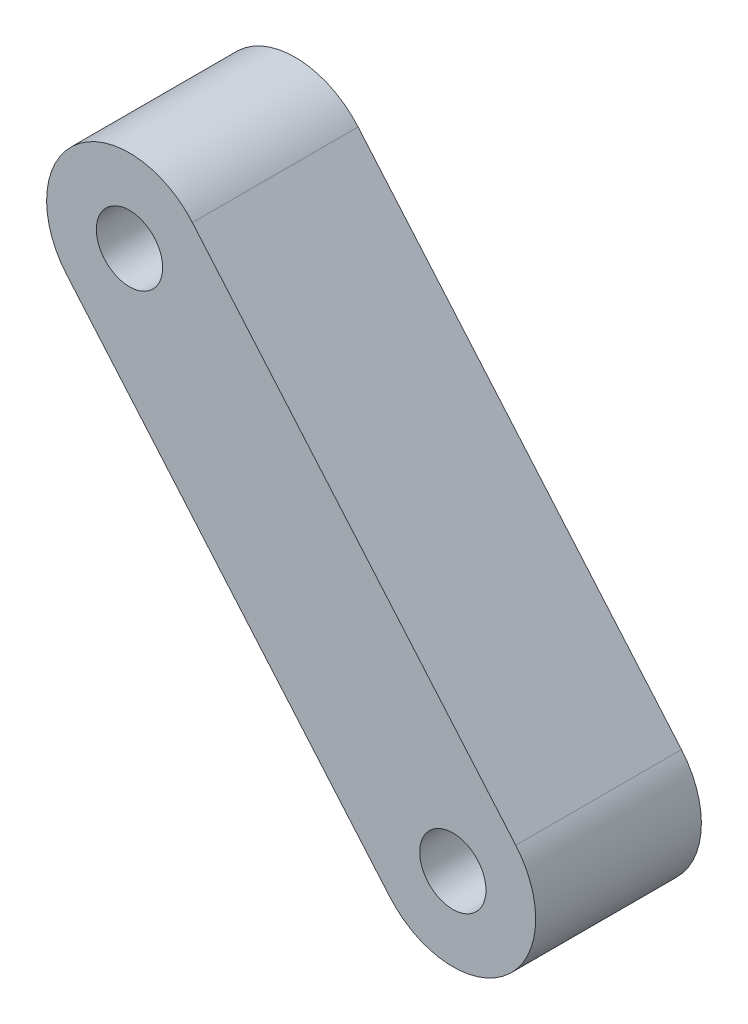
ISO-10303-21;
HEADER;
FILE_DESCRIPTION(('STEP AP214'),'2;1');
FILE_NAME('part.step','',(''),(''),'','','');
FILE_SCHEMA(('AUTOMOTIVE_DESIGN { 1 0 10303 214 1 1 1 1 }'));
ENDSEC;
DATA;
#1=APPLICATION_CONTEXT('core data for automotive mechanical design processes');
#2=APPLICATION_PROTOCOL_DEFINITION('international standard','automotive_design',2000,#1);
#3=PRODUCT_CONTEXT('',#1,'mechanical');
#4=PRODUCT('Part','Part','',(#3));
#5=PRODUCT_RELATED_PRODUCT_CATEGORY('part','',(#4));
#6=PRODUCT_DEFINITION_FORMATION('','',#4);
#7=PRODUCT_DEFINITION_CONTEXT('part definition',#1,'design');
#8=PRODUCT_DEFINITION('design','',#6,#7);
#9=PRODUCT_DEFINITION_SHAPE('','',#8);
#10=(LENGTH_UNIT() NAMED_UNIT(*) SI_UNIT(.MILLI.,.METRE.));
#11=(NAMED_UNIT(*) PLANE_ANGLE_UNIT() SI_UNIT($,.RADIAN.));
#12=(NAMED_UNIT(*) SI_UNIT($,.STERADIAN.) SOLID_ANGLE_UNIT());
#13=UNCERTAINTY_MEASURE_WITH_UNIT(LENGTH_MEASURE(1.E-05),#10,'distance_accuracy_value','');
#14=(GEOMETRIC_REPRESENTATION_CONTEXT(3) GLOBAL_UNCERTAINTY_ASSIGNED_CONTEXT((#13)) GLOBAL_UNIT_ASSIGNED_CONTEXT((#10,
#11,#12)) REPRESENTATION_CONTEXT('',''));
#15=CARTESIAN_POINT('',(0.,0.,0.));
#16=DIRECTION('',(0.,0.,1.));
#17=DIRECTION('',(1.,0.,0.));
#18=AXIS2_PLACEMENT_3D('',#15,#16,#17);
#19=CARTESIAN_POINT('',(46.,10.,10.));
#20=DIRECTION('',(0.,0.,1.));
#21=DIRECTION('',(1.,0.,0.));
#22=AXIS2_PLACEMENT_3D('',#19,#20,#21);
#23=PLANE('',#22);
#24=CARTESIAN_POINT('',(26.4847521808629,32.7849753688185,10.));
#25=DIRECTION('',(0.,0.,1.));
#26=DIRECTION('',(1.,0.,0.));
#27=AXIS2_PLACEMENT_3D('',#24,#25,#26);
#28=CIRCLE('',#27,2.);
#29=CARTESIAN_POINT('',(28.4847521808629,32.7849753688185,10.));
#30=VERTEX_POINT('',#29);
#31=EDGE_CURVE('E103',#30,#30,#28,.T.);
#32=ORIENTED_EDGE('',*,*,#31,.F.);
#33=EDGE_LOOP('',(#32));
#34=FACE_BOUND('',#33,.T.);
#35=CARTESIAN_POINT('',(46.,10.,10.));
#36=DIRECTION('',(0.,0.,1.));
#37=DIRECTION('',(1.,0.,0.));
#38=AXIS2_PLACEMENT_3D('',#35,#36,#37);
#39=CIRCLE('',#38,5.);
#40=CARTESIAN_POINT('',(42.2025041051969,6.74745869681048,10.));
#41=VERTEX_POINT('',#40);
#42=CARTESIAN_POINT('',(49.7974958948031,13.2525413031895,10.));
#43=VERTEX_POINT('',#42);
#44=EDGE_CURVE('E88',#41,#43,#39,.T.);
#45=ORIENTED_EDGE('',*,*,#44,.T.);
#46=DIRECTION('',(-0.650508260637904,0.759499178960615,0.));
#47=VECTOR('',#46,1.);
#48=CARTESIAN_POINT('',(49.7974958948031,13.2525413031895,10.));
#49=LINE('',#48,#47);
#50=CARTESIAN_POINT('',(30.2822480756659,36.037516672008,10.));
#51=VERTEX_POINT('',#50);
#52=EDGE_CURVE('E83',#43,#51,#49,.T.);
#53=ORIENTED_EDGE('',*,*,#52,.T.);
#54=CARTESIAN_POINT('',(26.4847521808629,32.7849753688185,10.));
#55=DIRECTION('',(0.,0.,1.));
#56=DIRECTION('',(1.,0.,0.));
#57=AXIS2_PLACEMENT_3D('',#54,#55,#56);
#58=CIRCLE('',#57,5.);
#59=CARTESIAN_POINT('',(22.6872562860598,29.5324340656289,10.));
#60=VERTEX_POINT('',#59);
#61=EDGE_CURVE('E86',#51,#60,#58,.T.);
#62=ORIENTED_EDGE('',*,*,#61,.T.);
#63=DIRECTION('',(0.650508260637904,-0.759499178960615,0.));
#64=VECTOR('',#63,1.);
#65=CARTESIAN_POINT('',(42.2025041051969,6.74745869681048,10.));
#66=LINE('',#65,#64);
#67=EDGE_CURVE('E53',#60,#41,#66,.T.);
#68=ORIENTED_EDGE('',*,*,#67,.T.);
#69=EDGE_LOOP('',(#45,#53,#62,#68));
#70=FACE_BOUND('',#69,.T.);
#71=CARTESIAN_POINT('',(46.,10.,10.));
#72=DIRECTION('',(0.,0.,1.));
#73=DIRECTION('',(1.,0.,0.));
#74=AXIS2_PLACEMENT_3D('',#71,#72,#73);
#75=CIRCLE('',#74,2.);
#76=CARTESIAN_POINT('',(48.,10.,10.));
#77=VERTEX_POINT('',#76);
#78=EDGE_CURVE('E118',#77,#77,#75,.T.);
#79=ORIENTED_EDGE('',*,*,#78,.F.);
#80=EDGE_LOOP('',(#79));
#81=FACE_BOUND('',#80,.T.);
#82=ADVANCED_FACE('F36',(#34,#70,#81),#23,.T.);
#83=CARTESIAN_POINT('',(46.,10.,0.));
#84=DIRECTION('',(0.,0.,1.));
#85=DIRECTION('',(1.,0.,0.));
#86=AXIS2_PLACEMENT_3D('',#83,#84,#85);
#87=PLANE('',#86);
#88=CARTESIAN_POINT('',(46.,10.,0.));
#89=DIRECTION('',(0.,0.,1.));
#90=DIRECTION('',(1.,0.,0.));
#91=AXIS2_PLACEMENT_3D('',#88,#89,#90);
#92=CIRCLE('',#91,5.);
#93=CARTESIAN_POINT('',(42.2025041051969,6.74745869681048,0.));
#94=VERTEX_POINT('',#93);
#95=CARTESIAN_POINT('',(49.7974958948031,13.2525413031895,0.));
#96=VERTEX_POINT('',#95);
#97=EDGE_CURVE('E100',#94,#96,#92,.T.);
#98=ORIENTED_EDGE('',*,*,#97,.F.);
#99=DIRECTION('',(0.650508260637904,-0.759499178960615,0.));
#100=VECTOR('',#99,1.);
#101=CARTESIAN_POINT('',(42.2025041051969,6.74745869681048,0.));
#102=LINE('',#101,#100);
#103=CARTESIAN_POINT('',(22.6872562860598,29.5324340656289,0.));
#104=VERTEX_POINT('',#103);
#105=EDGE_CURVE('E76',#104,#94,#102,.T.);
#106=ORIENTED_EDGE('',*,*,#105,.F.);
#107=CARTESIAN_POINT('',(26.4847521808629,32.7849753688185,0.));
#108=DIRECTION('',(0.,0.,1.));
#109=DIRECTION('',(1.,0.,0.));
#110=AXIS2_PLACEMENT_3D('',#107,#108,#109);
#111=CIRCLE('',#110,5.);
#112=CARTESIAN_POINT('',(30.2822480756659,36.037516672008,0.));
#113=VERTEX_POINT('',#112);
#114=EDGE_CURVE('E70',#113,#104,#111,.T.);
#115=ORIENTED_EDGE('',*,*,#114,.F.);
#116=DIRECTION('',(-0.650508260637904,0.759499178960615,0.));
#117=VECTOR('',#116,1.);
#118=CARTESIAN_POINT('',(49.7974958948031,13.2525413031895,0.));
#119=LINE('',#118,#117);
#120=EDGE_CURVE('E92',#96,#113,#119,.T.);
#121=ORIENTED_EDGE('',*,*,#120,.F.);
#122=EDGE_LOOP('',(#98,#106,#115,#121));
#123=FACE_BOUND('',#122,.T.);
#124=CARTESIAN_POINT('',(26.4847521808629,32.7849753688185,0.));
#125=DIRECTION('',(0.,0.,1.));
#126=DIRECTION('',(1.,0.,0.));
#127=AXIS2_PLACEMENT_3D('',#124,#125,#126);
#128=CIRCLE('',#127,2.);
#129=CARTESIAN_POINT('',(28.4847521808629,32.7849753688185,0.));
#130=VERTEX_POINT('',#129);
#131=EDGE_CURVE('E115',#130,#130,#128,.T.);
#132=ORIENTED_EDGE('',*,*,#131,.T.);
#133=EDGE_LOOP('',(#132));
#134=FACE_BOUND('',#133,.T.);
#135=CARTESIAN_POINT('',(46.,10.,0.));
#136=DIRECTION('',(0.,0.,1.));
#137=DIRECTION('',(1.,0.,0.));
#138=AXIS2_PLACEMENT_3D('',#135,#136,#137);
#139=CIRCLE('',#138,2.);
#140=CARTESIAN_POINT('',(48.,10.,0.));
#141=VERTEX_POINT('',#140);
#142=EDGE_CURVE('E121',#141,#141,#139,.T.);
#143=ORIENTED_EDGE('',*,*,#142,.T.);
#144=EDGE_LOOP('',(#143));
#145=FACE_BOUND('',#144,.T.);
#146=ADVANCED_FACE('F111',(#123,#134,#145),#87,.F.);
#147=CARTESIAN_POINT('',(46.,10.,10.));
#148=DIRECTION('',(0.,0.,-1.));
#149=DIRECTION('',(-1.,0.,0.));
#150=AXIS2_PLACEMENT_3D('',#147,#148,#149);
#151=CYLINDRICAL_SURFACE('',#150,5.);
#152=ORIENTED_EDGE('',*,*,#97,.T.);
#153=DIRECTION('',(0.,0.,-1.));
#154=VECTOR('',#153,1.);
#155=CARTESIAN_POINT('',(49.7974958948031,13.2525413031895,10.));
#156=LINE('',#155,#154);
#157=EDGE_CURVE('E11',#43,#96,#156,.T.);
#158=ORIENTED_EDGE('',*,*,#157,.F.);
#159=ORIENTED_EDGE('',*,*,#44,.F.);
#160=DIRECTION('',(0.,0.,-1.));
#161=VECTOR('',#160,1.);
#162=CARTESIAN_POINT('',(42.2025041051969,6.74745869681048,10.));
#163=LINE('',#162,#161);
#164=EDGE_CURVE('E96',#41,#94,#163,.T.);
#165=ORIENTED_EDGE('',*,*,#164,.T.);
#166=EDGE_LOOP('',(#152,#158,#159,#165));
#167=FACE_BOUND('',#166,.T.);
#168=ADVANCED_FACE('F38',(#167),#151,.T.);
#169=CARTESIAN_POINT('',(49.7974958948031,13.2525413031895,10.));
#170=DIRECTION('',(-0.759499178960615,-0.650508260637904,0.));
#171=DIRECTION('',(0.650508260637904,-0.759499178960615,0.));
#172=AXIS2_PLACEMENT_3D('',#169,#170,#171);
#173=PLANE('',#172);
#174=ORIENTED_EDGE('',*,*,#120,.T.);
#175=DIRECTION('',(0.,0.,-1.));
#176=VECTOR('',#175,1.);
#177=CARTESIAN_POINT('',(30.2822480756659,36.037516672008,10.));
#178=LINE('',#177,#176);
#179=EDGE_CURVE('E45',#51,#113,#178,.T.);
#180=ORIENTED_EDGE('',*,*,#179,.F.);
#181=ORIENTED_EDGE('',*,*,#52,.F.);
#182=ORIENTED_EDGE('',*,*,#157,.T.);
#183=EDGE_LOOP('',(#174,#180,#181,#182));
#184=FACE_BOUND('',#183,.T.);
#185=ADVANCED_FACE('F91',(#184),#173,.F.);
#186=CARTESIAN_POINT('',(26.4847521808629,32.7849753688185,10.));
#187=DIRECTION('',(0.,0.,-1.));
#188=DIRECTION('',(-1.,0.,0.));
#189=AXIS2_PLACEMENT_3D('',#186,#187,#188);
#190=CYLINDRICAL_SURFACE('',#189,5.);
#191=ORIENTED_EDGE('',*,*,#114,.T.);
#192=DIRECTION('',(0.,0.,-1.));
#193=VECTOR('',#192,1.);
#194=CARTESIAN_POINT('',(22.6872562860598,29.5324340656289,10.));
#195=LINE('',#194,#193);
#196=EDGE_CURVE('E93',#60,#104,#195,.T.);
#197=ORIENTED_EDGE('',*,*,#196,.F.);
#198=ORIENTED_EDGE('',*,*,#61,.F.);
#199=ORIENTED_EDGE('',*,*,#179,.T.);
#200=EDGE_LOOP('',(#191,#197,#198,#199));
#201=FACE_BOUND('',#200,.T.);
#202=ADVANCED_FACE('F94',(#201),#190,.T.);
#203=CARTESIAN_POINT('',(42.2025041051969,6.74745869681048,10.));
#204=DIRECTION('',(0.759499178960615,0.650508260637904,0.));
#205=DIRECTION('',(-0.650508260637904,0.759499178960615,0.));
#206=AXIS2_PLACEMENT_3D('',#203,#204,#205);
#207=PLANE('',#206);
#208=ORIENTED_EDGE('',*,*,#105,.T.);
#209=ORIENTED_EDGE('',*,*,#164,.F.);
#210=ORIENTED_EDGE('',*,*,#67,.F.);
#211=ORIENTED_EDGE('',*,*,#196,.T.);
#212=EDGE_LOOP('',(#208,#209,#210,#211));
#213=FACE_BOUND('',#212,.T.);
#214=ADVANCED_FACE('F108',(#213),#207,.F.);
#215=CARTESIAN_POINT('',(26.4847521808629,32.7849753688185,10.));
#216=DIRECTION('',(0.,0.,-1.));
#217=DIRECTION('',(-1.,0.,0.));
#218=AXIS2_PLACEMENT_3D('',#215,#216,#217);
#219=CYLINDRICAL_SURFACE('',#218,2.);
#220=ORIENTED_EDGE('',*,*,#31,.T.);
#221=EDGE_LOOP('',(#220));
#222=FACE_BOUND('',#221,.T.);
#223=ORIENTED_EDGE('',*,*,#131,.F.);
#224=EDGE_LOOP('',(#223));
#225=FACE_BOUND('',#224,.T.);
#226=ADVANCED_FACE('F138',(#222,#225),#219,.F.);
#227=CARTESIAN_POINT('',(46.,10.,10.));
#228=DIRECTION('',(0.,0.,-1.));
#229=DIRECTION('',(-1.,0.,0.));
#230=AXIS2_PLACEMENT_3D('',#227,#228,#229);
#231=CYLINDRICAL_SURFACE('',#230,2.);
#232=ORIENTED_EDGE('',*,*,#78,.T.);
#233=EDGE_LOOP('',(#232));
#234=FACE_BOUND('',#233,.T.);
#235=ORIENTED_EDGE('',*,*,#142,.F.);
#236=EDGE_LOOP('',(#235));
#237=FACE_BOUND('',#236,.T.);
#238=ADVANCED_FACE('F127',(#234,#237),#231,.F.);
#239=CLOSED_SHELL('',(#82,#146,#168,#185,#202,#214,#226,#238));
#240=MANIFOLD_SOLID_BREP('B2',#239);
#241=ADVANCED_BREP_SHAPE_REPRESENTATION('',(#18,#240),#14);
#242=SHAPE_DEFINITION_REPRESENTATION(#9,#241);
ENDSEC;
END-ISO-10303-21;
